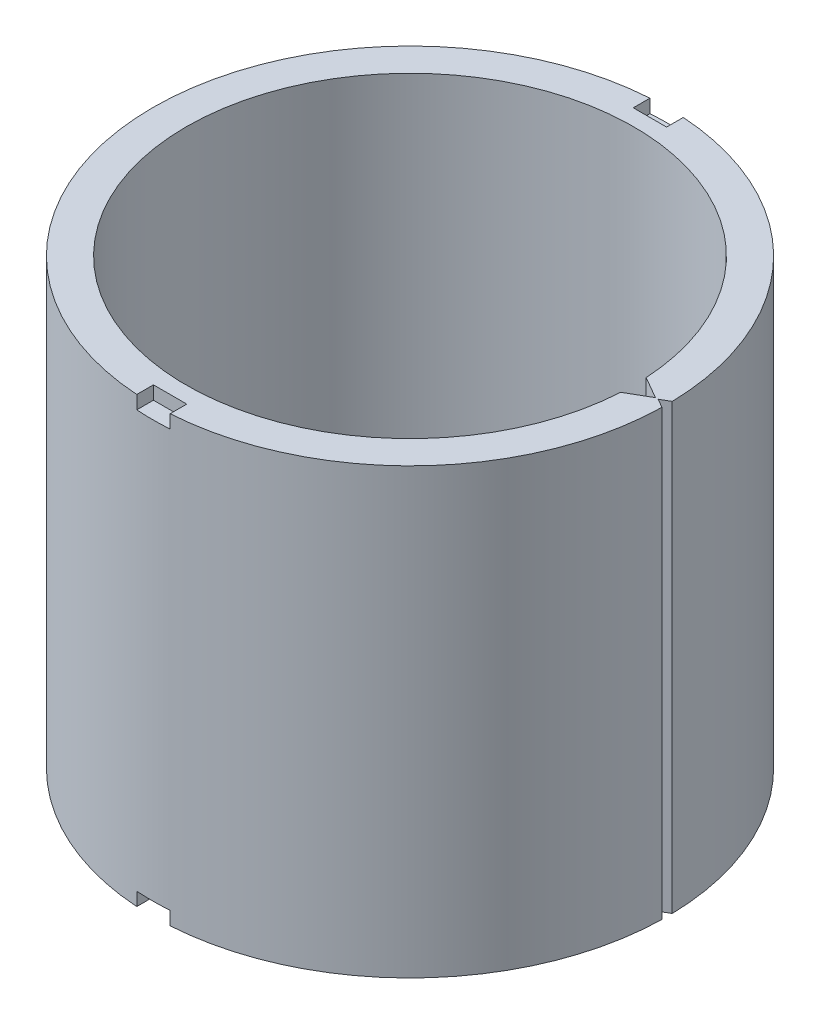
ISO-10303-21;
HEADER;
FILE_DESCRIPTION(('STEP AP214'),'2;1');
FILE_NAME('part.step','',(''),(''),'','','');
FILE_SCHEMA(('AUTOMOTIVE_DESIGN { 1 0 10303 214 1 1 1 1 }'));
ENDSEC;
DATA;
#1=APPLICATION_CONTEXT('core data for automotive mechanical design processes');
#2=APPLICATION_PROTOCOL_DEFINITION('international standard','automotive_design',2000,#1);
#3=PRODUCT_CONTEXT('',#1,'mechanical');
#4=PRODUCT('Part','Part','',(#3));
#5=PRODUCT_RELATED_PRODUCT_CATEGORY('part','',(#4));
#6=PRODUCT_DEFINITION_FORMATION('','',#4);
#7=PRODUCT_DEFINITION_CONTEXT('part definition',#1,'design');
#8=PRODUCT_DEFINITION('design','',#6,#7);
#9=PRODUCT_DEFINITION_SHAPE('','',#8);
#10=(LENGTH_UNIT() NAMED_UNIT(*) SI_UNIT(.MILLI.,.METRE.));
#11=(NAMED_UNIT(*) PLANE_ANGLE_UNIT() SI_UNIT($,.RADIAN.));
#12=(NAMED_UNIT(*) SI_UNIT($,.STERADIAN.) SOLID_ANGLE_UNIT());
#13=UNCERTAINTY_MEASURE_WITH_UNIT(LENGTH_MEASURE(1.E-05),#10,'distance_accuracy_value','');
#14=(GEOMETRIC_REPRESENTATION_CONTEXT(3) GLOBAL_UNCERTAINTY_ASSIGNED_CONTEXT((#13)) GLOBAL_UNIT_ASSIGNED_CONTEXT((#10,
#11,#12)) REPRESENTATION_CONTEXT('',''));
#15=CARTESIAN_POINT('',(0.,0.,0.));
#16=DIRECTION('',(0.,0.,1.));
#17=DIRECTION('',(1.,0.,0.));
#18=AXIS2_PLACEMENT_3D('',#15,#16,#17);
#19=CARTESIAN_POINT('',(24.4774366852604,0.,0.));
#20=DIRECTION('',(0.,1.,0.));
#21=DIRECTION('',(-1.,0.,0.));
#22=AXIS2_PLACEMENT_3D('',#19,#20,#21);
#23=PLANE('',#22);
#24=DIRECTION('',(0.866025403784441,0.,-0.499999999999995));
#25=VECTOR('',#24,1.);
#26=CARTESIAN_POINT('',(23.368,0.,0.));
#27=LINE('',#26,#25);
#28=CARTESIAN_POINT('',(21.2679023900433,0.,1.21249192043296));
#29=VERTEX_POINT('',#28);
#30=CARTESIAN_POINT('',(23.368,0.,0.));
#31=VERTEX_POINT('',#30);
#32=EDGE_CURVE('E381',#29,#31,#27,.T.);
#33=ORIENTED_EDGE('',*,*,#32,.T.);
#34=DIRECTION('',(-0.866025403784438,0.,-0.500000000000001));
#35=VECTOR('',#34,1.);
#36=CARTESIAN_POINT('',(21.2679023900433,0.,-1.21249192043298));
#37=LINE('',#36,#35);
#38=CARTESIAN_POINT('',(21.2679023900433,0.,-1.21249192043298));
#39=VERTEX_POINT('',#38);
#40=EDGE_CURVE('E382',#31,#39,#37,.T.);
#41=ORIENTED_EDGE('',*,*,#40,.T.);
#42=CARTESIAN_POINT('',(0.,0.,0.));
#43=DIRECTION('',(0.,1.,0.));
#44=DIRECTION('',(-1.,0.,0.));
#45=AXIS2_PLACEMENT_3D('',#42,#43,#44);
#46=CIRCLE('',#45,21.3024366852603);
#47=EDGE_CURVE('E226',#39,#29,#46,.T.);
#48=ORIENTED_EDGE('',*,*,#47,.T.);
#49=EDGE_LOOP('',(#33,#41,#48));
#50=FACE_BOUND('',#49,.T.);
#51=DIRECTION('',(-0.866025403784443,0.,0.499999999999993));
#52=VECTOR('',#51,1.);
#53=CARTESIAN_POINT('',(24.4725107788167,0.,-0.491042627098511));
#54=LINE('',#53,#52);
#55=CARTESIAN_POINT('',(24.4725107788167,0.,-0.491042627098511));
#56=VERTEX_POINT('',#55);
#57=CARTESIAN_POINT('',(23.622,0.,0.));
#58=VERTEX_POINT('',#57);
#59=EDGE_CURVE('E184',#56,#58,#54,.T.);
#60=ORIENTED_EDGE('',*,*,#59,.T.);
#61=DIRECTION('',(0.866025403784438,0.,0.500000000000002));
#62=VECTOR('',#61,1.);
#63=CARTESIAN_POINT('',(23.622,0.,0.));
#64=LINE('',#63,#62);
#65=CARTESIAN_POINT('',(24.4725107788167,0.,0.491042627098525));
#66=VERTEX_POINT('',#65);
#67=EDGE_CURVE('E192',#58,#66,#64,.T.);
#68=ORIENTED_EDGE('',*,*,#67,.T.);
#69=CARTESIAN_POINT('',(0.,0.,0.));
#70=DIRECTION('',(0.,1.,0.));
#71=DIRECTION('',(-1.,0.,0.));
#72=AXIS2_PLACEMENT_3D('',#69,#70,#71);
#73=CIRCLE('',#72,24.4774366852604);
#74=CARTESIAN_POINT('',(1.58750000000001,0.,24.4259032674521));
#75=VERTEX_POINT('',#74);
#76=EDGE_CURVE('E209',#75,#66,#73,.T.);
#77=ORIENTED_EDGE('',*,*,#76,.F.);
#78=DIRECTION('',(0.,0.,-1.));
#79=VECTOR('',#78,1.);
#80=CARTESIAN_POINT('',(1.58750000000001,0.,26.0134032674521));
#81=LINE('',#80,#79);
#82=CARTESIAN_POINT('',(1.58750000000001,0.,22.8384032674521));
#83=VERTEX_POINT('',#82);
#84=EDGE_CURVE('E203',#75,#83,#81,.T.);
#85=ORIENTED_EDGE('',*,*,#84,.T.);
#86=DIRECTION('',(-1.,0.,0.));
#87=VECTOR('',#86,1.);
#88=CARTESIAN_POINT('',(1.58750000000001,0.,22.8384032674521));
#89=LINE('',#88,#87);
#90=CARTESIAN_POINT('',(-1.58750000000001,0.,22.8384032674521));
#91=VERTEX_POINT('',#90);
#92=EDGE_CURVE('E292',#83,#91,#89,.T.);
#93=ORIENTED_EDGE('',*,*,#92,.T.);
#94=DIRECTION('',(0.,0.,1.));
#95=VECTOR('',#94,1.);
#96=CARTESIAN_POINT('',(-1.58750000000001,0.,26.0134032674521));
#97=LINE('',#96,#95);
#98=CARTESIAN_POINT('',(-1.58750000000001,0.,24.4259032674521));
#99=VERTEX_POINT('',#98);
#100=EDGE_CURVE('E299',#91,#99,#97,.T.);
#101=ORIENTED_EDGE('',*,*,#100,.T.);
#102=CARTESIAN_POINT('',(-1.5875,0.,-24.4259032674521));
#103=VERTEX_POINT('',#102);
#104=EDGE_CURVE('E210',#103,#99,#73,.T.);
#105=ORIENTED_EDGE('',*,*,#104,.F.);
#106=DIRECTION('',(0.,0.,1.));
#107=VECTOR('',#106,1.);
#108=CARTESIAN_POINT('',(-1.5875,0.,-26.0134032674521));
#109=LINE('',#108,#107);
#110=CARTESIAN_POINT('',(-1.5875,0.,-22.8384032674521));
#111=VERTEX_POINT('',#110);
#112=EDGE_CURVE('E273',#103,#111,#109,.T.);
#113=ORIENTED_EDGE('',*,*,#112,.T.);
#114=DIRECTION('',(1.,0.,0.));
#115=VECTOR('',#114,1.);
#116=CARTESIAN_POINT('',(-1.5875,0.,-22.8384032674521));
#117=LINE('',#116,#115);
#118=CARTESIAN_POINT('',(1.5875,0.,-22.8384032674521));
#119=VERTEX_POINT('',#118);
#120=EDGE_CURVE('E269',#111,#119,#117,.T.);
#121=ORIENTED_EDGE('',*,*,#120,.T.);
#122=DIRECTION('',(0.,0.,-1.));
#123=VECTOR('',#122,1.);
#124=CARTESIAN_POINT('',(1.5875,0.,-26.0134032674521));
#125=LINE('',#124,#123);
#126=CARTESIAN_POINT('',(1.5875,0.,-24.4259032674521));
#127=VERTEX_POINT('',#126);
#128=EDGE_CURVE('E208',#119,#127,#125,.T.);
#129=ORIENTED_EDGE('',*,*,#128,.T.);
#130=EDGE_CURVE('E199',#56,#127,#73,.T.);
#131=ORIENTED_EDGE('',*,*,#130,.F.);
#132=EDGE_LOOP('',(#60,#68,#77,#85,#93,#101,#105,#113,#121,#129,#131));
#133=FACE_BOUND('',#132,.T.);
#134=ADVANCED_FACE('F37',(#50,#133),#23,.F.);
#135=CARTESIAN_POINT('',(0.,38.0941971854585,0.));
#136=DIRECTION('',(0.,1.,0.));
#137=DIRECTION('',(-1.,0.,0.));
#138=AXIS2_PLACEMENT_3D('',#135,#136,#137);
#139=CYLINDRICAL_SURFACE('',#138,24.4774366852604);
#140=DIRECTION('',(0.,-1.,0.));
#141=VECTOR('',#140,1.);
#142=CARTESIAN_POINT('',(24.4725107788167,42.2216971854585,-0.491042627098511));
#143=LINE('',#142,#141);
#144=CARTESIAN_POINT('',(24.4725107788167,42.2216971854585,-0.491042627098511));
#145=VERTEX_POINT('',#144);
#146=EDGE_CURVE('E187',#145,#56,#143,.T.);
#147=ORIENTED_EDGE('',*,*,#146,.T.);
#148=ORIENTED_EDGE('',*,*,#130,.T.);
#149=DIRECTION('',(0.,1.,0.));
#150=VECTOR('',#149,1.);
#151=CARTESIAN_POINT('',(1.5875,38.0941971854585,-24.4259032674521));
#152=LINE('',#151,#150);
#153=CARTESIAN_POINT('',(1.5875,1.27,-24.4259032674521));
#154=VERTEX_POINT('',#153);
#155=EDGE_CURVE('E44',#154,#127,#152,.F.);
#156=ORIENTED_EDGE('',*,*,#155,.F.);
#157=CARTESIAN_POINT('',(0.,1.27,0.));
#158=DIRECTION('',(0.,-1.,0.));
#159=DIRECTION('',(1.,0.,0.));
#160=AXIS2_PLACEMENT_3D('',#157,#158,#159);
#161=CIRCLE('',#160,24.4774366852604);
#162=CARTESIAN_POINT('',(-1.5875,1.27,-24.4259032674521));
#163=VERTEX_POINT('',#162);
#164=EDGE_CURVE('E251',#163,#154,#161,.T.);
#165=ORIENTED_EDGE('',*,*,#164,.F.);
#166=DIRECTION('',(0.,1.,0.));
#167=VECTOR('',#166,1.);
#168=CARTESIAN_POINT('',(-1.5875,38.0941971854585,-24.4259032674521));
#169=LINE('',#168,#167);
#170=EDGE_CURVE('E11',#103,#163,#169,.T.);
#171=ORIENTED_EDGE('',*,*,#170,.F.);
#172=ORIENTED_EDGE('',*,*,#104,.T.);
#173=DIRECTION('',(0.,1.,0.));
#174=VECTOR('',#173,1.);
#175=CARTESIAN_POINT('',(-1.58750000000001,38.0941971854585,24.4259032674521));
#176=LINE('',#175,#174);
#177=CARTESIAN_POINT('',(-1.58750000000001,1.27,24.4259032674521));
#178=VERTEX_POINT('',#177);
#179=EDGE_CURVE('E246',#178,#99,#176,.F.);
#180=ORIENTED_EDGE('',*,*,#179,.F.);
#181=CARTESIAN_POINT('',(0.,1.27,0.));
#182=DIRECTION('',(0.,-1.,0.));
#183=DIRECTION('',(1.,0.,0.));
#184=AXIS2_PLACEMENT_3D('',#181,#182,#183);
#185=CIRCLE('',#184,24.4774366852604);
#186=CARTESIAN_POINT('',(1.58750000000001,1.27,24.4259032674521));
#187=VERTEX_POINT('',#186);
#188=EDGE_CURVE('E244',#187,#178,#185,.T.);
#189=ORIENTED_EDGE('',*,*,#188,.F.);
#190=DIRECTION('',(0.,1.,0.));
#191=VECTOR('',#190,1.);
#192=CARTESIAN_POINT('',(1.58750000000001,38.0941971854585,24.4259032674521));
#193=LINE('',#192,#191);
#194=EDGE_CURVE('E248',#75,#187,#193,.T.);
#195=ORIENTED_EDGE('',*,*,#194,.F.);
#196=ORIENTED_EDGE('',*,*,#76,.T.);
#197=DIRECTION('',(0.,-1.,0.));
#198=VECTOR('',#197,1.);
#199=CARTESIAN_POINT('',(24.4725107788167,42.2216971854585,0.491042627098525));
#200=LINE('',#199,#198);
#201=CARTESIAN_POINT('',(24.4725107788167,42.2216971854585,0.491042627098525));
#202=VERTEX_POINT('',#201);
#203=EDGE_CURVE('E610',#202,#66,#200,.T.);
#204=ORIENTED_EDGE('',*,*,#203,.F.);
#205=CARTESIAN_POINT('',(0.,42.2216971854585,0.));
#206=DIRECTION('',(0.,1.,0.));
#207=DIRECTION('',(-1.,0.,0.));
#208=AXIS2_PLACEMENT_3D('',#205,#206,#207);
#209=CIRCLE('',#208,24.4774366852604);
#210=CARTESIAN_POINT('',(1.58750000000001,42.2216971854585,24.4259032674521));
#211=VERTEX_POINT('',#210);
#212=EDGE_CURVE('E222',#211,#202,#209,.T.);
#213=ORIENTED_EDGE('',*,*,#212,.F.);
#214=DIRECTION('',(0.,1.,0.));
#215=VECTOR('',#214,1.);
#216=CARTESIAN_POINT('',(1.58750000000001,38.0941971854585,24.4259032674521));
#217=LINE('',#216,#215);
#218=CARTESIAN_POINT('',(1.58750000000001,40.9516971854585,24.4259032674521));
#219=VERTEX_POINT('',#218);
#220=EDGE_CURVE('E234',#211,#219,#217,.F.);
#221=ORIENTED_EDGE('',*,*,#220,.T.);
#222=CARTESIAN_POINT('',(0.,40.9516971854585,0.));
#223=DIRECTION('',(0.,1.,0.));
#224=DIRECTION('',(0.,0.,1.));
#225=AXIS2_PLACEMENT_3D('',#222,#223,#224);
#226=CIRCLE('',#225,24.4774366852604);
#227=CARTESIAN_POINT('',(-1.58750000000001,40.9516971854585,24.4259032674521));
#228=VERTEX_POINT('',#227);
#229=EDGE_CURVE('E229',#228,#219,#226,.T.);
#230=ORIENTED_EDGE('',*,*,#229,.F.);
#231=DIRECTION('',(0.,1.,0.));
#232=VECTOR('',#231,1.);
#233=CARTESIAN_POINT('',(-1.58750000000001,38.0941971854585,24.4259032674521));
#234=LINE('',#233,#232);
#235=CARTESIAN_POINT('',(-1.58750000000001,42.2216971854585,24.4259032674521));
#236=VERTEX_POINT('',#235);
#237=EDGE_CURVE('E231',#228,#236,#234,.T.);
#238=ORIENTED_EDGE('',*,*,#237,.T.);
#239=CARTESIAN_POINT('',(-1.5875,42.2216971854585,-24.4259032674521));
#240=VERTEX_POINT('',#239);
#241=EDGE_CURVE('E213',#240,#236,#209,.T.);
#242=ORIENTED_EDGE('',*,*,#241,.F.);
#243=DIRECTION('',(0.,1.,0.));
#244=VECTOR('',#243,1.);
#245=CARTESIAN_POINT('',(-1.5875,38.0941971854585,-24.4259032674521));
#246=LINE('',#245,#244);
#247=CARTESIAN_POINT('',(-1.5875,40.9516971854585,-24.4259032674521));
#248=VERTEX_POINT('',#247);
#249=EDGE_CURVE('E241',#240,#248,#246,.F.);
#250=ORIENTED_EDGE('',*,*,#249,.T.);
#251=CARTESIAN_POINT('',(0.,40.9516971854585,0.));
#252=DIRECTION('',(0.,1.,0.));
#253=DIRECTION('',(0.,0.,1.));
#254=AXIS2_PLACEMENT_3D('',#251,#252,#253);
#255=CIRCLE('',#254,24.4774366852604);
#256=CARTESIAN_POINT('',(1.5875,40.9516971854585,-24.4259032674521));
#257=VERTEX_POINT('',#256);
#258=EDGE_CURVE('E237',#257,#248,#255,.T.);
#259=ORIENTED_EDGE('',*,*,#258,.F.);
#260=DIRECTION('',(0.,1.,0.));
#261=VECTOR('',#260,1.);
#262=CARTESIAN_POINT('',(1.5875,38.0941971854585,-24.4259032674521));
#263=LINE('',#262,#261);
#264=CARTESIAN_POINT('',(1.5875,42.2216971854585,-24.4259032674521));
#265=VERTEX_POINT('',#264);
#266=EDGE_CURVE('E239',#257,#265,#263,.T.);
#267=ORIENTED_EDGE('',*,*,#266,.T.);
#268=EDGE_CURVE('E202',#145,#265,#209,.T.);
#269=ORIENTED_EDGE('',*,*,#268,.F.);
#270=EDGE_LOOP('',(#147,#148,#156,#165,#171,#172,#180,#189,#195,#196,#204,#213,#221,#230,#238,
#242,#250,#259,#267,#269));
#271=FACE_BOUND('',#270,.T.);
#272=ADVANCED_FACE('F197',(#271),#139,.T.);
#273=CARTESIAN_POINT('',(0.,38.0941971854585,0.));
#274=DIRECTION('',(0.,1.,0.));
#275=DIRECTION('',(-1.,0.,0.));
#276=AXIS2_PLACEMENT_3D('',#273,#274,#275);
#277=CYLINDRICAL_SURFACE('',#276,21.3024366852603);
#278=DIRECTION('',(0.,-1.,0.));
#279=VECTOR('',#278,1.);
#280=CARTESIAN_POINT('',(21.2679023900433,42.2216971854585,1.21249192043296));
#281=LINE('',#280,#279);
#282=CARTESIAN_POINT('',(21.2679023900433,42.2216971854585,1.21249192043296));
#283=VERTEX_POINT('',#282);
#284=EDGE_CURVE('E193',#283,#29,#281,.T.);
#285=ORIENTED_EDGE('',*,*,#284,.T.);
#286=ORIENTED_EDGE('',*,*,#47,.F.);
#287=DIRECTION('',(0.,-1.,0.));
#288=VECTOR('',#287,1.);
#289=CARTESIAN_POINT('',(21.2679023900433,42.2216971854585,-1.21249192043298));
#290=LINE('',#289,#288);
#291=CARTESIAN_POINT('',(21.2679023900433,42.2216971854585,-1.21249192043298));
#292=VERTEX_POINT('',#291);
#293=EDGE_CURVE('E394',#292,#39,#290,.T.);
#294=ORIENTED_EDGE('',*,*,#293,.F.);
#295=CARTESIAN_POINT('',(0.,42.2216971854585,0.));
#296=DIRECTION('',(0.,1.,0.));
#297=DIRECTION('',(-1.,0.,0.));
#298=AXIS2_PLACEMENT_3D('',#295,#296,#297);
#299=CIRCLE('',#298,21.3024366852603);
#300=EDGE_CURVE('E223',#292,#283,#299,.T.);
#301=ORIENTED_EDGE('',*,*,#300,.T.);
#302=EDGE_LOOP('',(#285,#286,#294,#301));
#303=FACE_BOUND('',#302,.T.);
#304=ADVANCED_FACE('F368',(#303),#277,.F.);
#305=CARTESIAN_POINT('',(21.3024366852603,42.2216971854585,0.));
#306=DIRECTION('',(0.,-1.,0.));
#307=DIRECTION('',(1.,0.,0.));
#308=AXIS2_PLACEMENT_3D('',#305,#306,#307);
#309=PLANE('',#308);
#310=DIRECTION('',(0.866025403784441,0.,-0.499999999999995));
#311=VECTOR('',#310,1.);
#312=CARTESIAN_POINT('',(23.368,42.2216971854585,0.));
#313=LINE('',#312,#311);
#314=CARTESIAN_POINT('',(23.368,42.2216971854585,0.));
#315=VERTEX_POINT('',#314);
#316=EDGE_CURVE('E387',#283,#315,#313,.T.);
#317=ORIENTED_EDGE('',*,*,#316,.F.);
#318=ORIENTED_EDGE('',*,*,#300,.F.);
#319=DIRECTION('',(-0.866025403784438,0.,-0.500000000000001));
#320=VECTOR('',#319,1.);
#321=CARTESIAN_POINT('',(21.2679023900433,42.2216971854585,-1.21249192043298));
#322=LINE('',#321,#320);
#323=EDGE_CURVE('E392',#315,#292,#322,.T.);
#324=ORIENTED_EDGE('',*,*,#323,.F.);
#325=EDGE_LOOP('',(#317,#318,#324));
#326=FACE_BOUND('',#325,.T.);
#327=DIRECTION('',(-0.866025403784443,0.,0.499999999999993));
#328=VECTOR('',#327,1.);
#329=CARTESIAN_POINT('',(24.4725107788167,42.2216971854585,-0.491042627098511));
#330=LINE('',#329,#328);
#331=CARTESIAN_POINT('',(23.622,42.2216971854585,0.));
#332=VERTEX_POINT('',#331);
#333=EDGE_CURVE('E607',#145,#332,#330,.T.);
#334=ORIENTED_EDGE('',*,*,#333,.F.);
#335=ORIENTED_EDGE('',*,*,#268,.T.);
#336=DIRECTION('',(0.,0.,-1.));
#337=VECTOR('',#336,1.);
#338=CARTESIAN_POINT('',(1.5875,42.2216971854585,-26.0134032674521));
#339=LINE('',#338,#337);
#340=CARTESIAN_POINT('',(1.5875,42.2216971854585,-22.8384032674521));
#341=VERTEX_POINT('',#340);
#342=EDGE_CURVE('E308',#341,#265,#339,.T.);
#343=ORIENTED_EDGE('',*,*,#342,.F.);
#344=DIRECTION('',(1.,0.,0.));
#345=VECTOR('',#344,1.);
#346=CARTESIAN_POINT('',(-1.5875,42.2216971854585,-22.8384032674521));
#347=LINE('',#346,#345);
#348=CARTESIAN_POINT('',(-1.5875,42.2216971854585,-22.8384032674521));
#349=VERTEX_POINT('',#348);
#350=EDGE_CURVE('E316',#349,#341,#347,.T.);
#351=ORIENTED_EDGE('',*,*,#350,.F.);
#352=DIRECTION('',(0.,0.,1.));
#353=VECTOR('',#352,1.);
#354=CARTESIAN_POINT('',(-1.5875,42.2216971854585,-26.0134032674521));
#355=LINE('',#354,#353);
#356=EDGE_CURVE('E314',#240,#349,#355,.T.);
#357=ORIENTED_EDGE('',*,*,#356,.F.);
#358=ORIENTED_EDGE('',*,*,#241,.T.);
#359=DIRECTION('',(0.,0.,1.));
#360=VECTOR('',#359,1.);
#361=CARTESIAN_POINT('',(-1.58750000000001,42.2216971854585,26.0134032674521));
#362=LINE('',#361,#360);
#363=CARTESIAN_POINT('',(-1.58750000000001,42.2216971854585,22.8384032674521));
#364=VERTEX_POINT('',#363);
#365=EDGE_CURVE('E328',#364,#236,#362,.T.);
#366=ORIENTED_EDGE('',*,*,#365,.F.);
#367=DIRECTION('',(-1.,0.,0.));
#368=VECTOR('',#367,1.);
#369=CARTESIAN_POINT('',(1.5875,42.2216971854585,22.8384032674521));
#370=LINE('',#369,#368);
#371=CARTESIAN_POINT('',(1.5875,42.2216971854585,22.8384032674521));
#372=VERTEX_POINT('',#371);
#373=EDGE_CURVE('E334',#372,#364,#370,.T.);
#374=ORIENTED_EDGE('',*,*,#373,.F.);
#375=DIRECTION('',(0.,0.,-1.));
#376=VECTOR('',#375,1.);
#377=CARTESIAN_POINT('',(1.58750000000001,42.2216971854585,26.0134032674521));
#378=LINE('',#377,#376);
#379=EDGE_CURVE('E286',#211,#372,#378,.T.);
#380=ORIENTED_EDGE('',*,*,#379,.F.);
#381=ORIENTED_EDGE('',*,*,#212,.T.);
#382=DIRECTION('',(0.866025403784438,0.,0.500000000000002));
#383=VECTOR('',#382,1.);
#384=CARTESIAN_POINT('',(23.622,42.2216971854585,0.));
#385=LINE('',#384,#383);
#386=EDGE_CURVE('E608',#332,#202,#385,.T.);
#387=ORIENTED_EDGE('',*,*,#386,.F.);
#388=EDGE_LOOP('',(#334,#335,#343,#351,#357,#358,#366,#374,#380,#381,#387));
#389=FACE_BOUND('',#388,.T.);
#390=ADVANCED_FACE('F350',(#326,#389),#309,.F.);
#391=CARTESIAN_POINT('',(1.58750000000001,40.9516971854585,26.0134032674521));
#392=DIRECTION('',(1.,0.,0.));
#393=DIRECTION('',(0.,0.,-1.));
#394=AXIS2_PLACEMENT_3D('',#391,#392,#393);
#395=PLANE('',#394);
#396=ORIENTED_EDGE('',*,*,#379,.T.);
#397=DIRECTION('',(0.,1.,0.));
#398=VECTOR('',#397,1.);
#399=CARTESIAN_POINT('',(1.5875,40.9516971854585,22.8384032674521));
#400=LINE('',#399,#398);
#401=CARTESIAN_POINT('',(1.5875,40.9516971854585,22.8384032674521));
#402=VERTEX_POINT('',#401);
#403=EDGE_CURVE('E218',#402,#372,#400,.T.);
#404=ORIENTED_EDGE('',*,*,#403,.F.);
#405=DIRECTION('',(0.,0.,-1.));
#406=VECTOR('',#405,1.);
#407=CARTESIAN_POINT('',(1.58750000000001,40.9516971854585,26.0134032674521));
#408=LINE('',#407,#406);
#409=EDGE_CURVE('E325',#219,#402,#408,.T.);
#410=ORIENTED_EDGE('',*,*,#409,.F.);
#411=ORIENTED_EDGE('',*,*,#220,.F.);
#412=EDGE_LOOP('',(#396,#404,#410,#411));
#413=FACE_BOUND('',#412,.T.);
#414=ADVANCED_FACE('F360',(#413),#395,.F.);
#415=CARTESIAN_POINT('',(-1.58750000000001,40.9516971854585,26.0134032674521));
#416=DIRECTION('',(-1.,0.,0.));
#417=DIRECTION('',(0.,0.,1.));
#418=AXIS2_PLACEMENT_3D('',#415,#416,#417);
#419=PLANE('',#418);
#420=DIRECTION('',(0.,0.,1.));
#421=VECTOR('',#420,1.);
#422=CARTESIAN_POINT('',(-1.58750000000001,40.9516971854585,26.0134032674521));
#423=LINE('',#422,#421);
#424=CARTESIAN_POINT('',(-1.58750000000001,40.9516971854585,22.8384032674521));
#425=VERTEX_POINT('',#424);
#426=EDGE_CURVE('E331',#425,#228,#423,.T.);
#427=ORIENTED_EDGE('',*,*,#426,.F.);
#428=DIRECTION('',(0.,1.,0.));
#429=VECTOR('',#428,1.);
#430=CARTESIAN_POINT('',(-1.58750000000001,40.9516971854585,22.8384032674521));
#431=LINE('',#430,#429);
#432=EDGE_CURVE('E317',#425,#364,#431,.T.);
#433=ORIENTED_EDGE('',*,*,#432,.T.);
#434=ORIENTED_EDGE('',*,*,#365,.T.);
#435=ORIENTED_EDGE('',*,*,#237,.F.);
#436=EDGE_LOOP('',(#427,#433,#434,#435));
#437=FACE_BOUND('',#436,.T.);
#438=ADVANCED_FACE('F356',(#437),#419,.F.);
#439=CARTESIAN_POINT('',(0.,40.9516971854585,0.));
#440=DIRECTION('',(0.,1.,0.));
#441=DIRECTION('',(0.,0.,1.));
#442=AXIS2_PLACEMENT_3D('',#439,#440,#441);
#443=PLANE('',#442);
#444=ORIENTED_EDGE('',*,*,#229,.T.);
#445=ORIENTED_EDGE('',*,*,#409,.T.);
#446=DIRECTION('',(-1.,0.,0.));
#447=VECTOR('',#446,1.);
#448=CARTESIAN_POINT('',(1.5875,40.9516971854585,22.8384032674521));
#449=LINE('',#448,#447);
#450=EDGE_CURVE('E327',#402,#425,#449,.T.);
#451=ORIENTED_EDGE('',*,*,#450,.T.);
#452=ORIENTED_EDGE('',*,*,#426,.T.);
#453=EDGE_LOOP('',(#444,#445,#451,#452));
#454=FACE_BOUND('',#453,.T.);
#455=ADVANCED_FACE('F359',(#454),#443,.T.);
#456=CARTESIAN_POINT('',(1.5875,40.9516971854585,22.8384032674521));
#457=DIRECTION('',(0.,0.,-1.));
#458=DIRECTION('',(-1.,0.,0.));
#459=AXIS2_PLACEMENT_3D('',#456,#457,#458);
#460=PLANE('',#459);
#461=ORIENTED_EDGE('',*,*,#373,.T.);
#462=ORIENTED_EDGE('',*,*,#432,.F.);
#463=ORIENTED_EDGE('',*,*,#450,.F.);
#464=ORIENTED_EDGE('',*,*,#403,.T.);
#465=EDGE_LOOP('',(#461,#462,#463,#464));
#466=FACE_BOUND('',#465,.T.);
#467=ADVANCED_FACE('F344',(#466),#460,.F.);
#468=CARTESIAN_POINT('',(-1.5875,40.9516971854585,-26.0134032674521));
#469=DIRECTION('',(-1.,0.,0.));
#470=DIRECTION('',(0.,0.,1.));
#471=AXIS2_PLACEMENT_3D('',#468,#469,#470);
#472=PLANE('',#471);
#473=ORIENTED_EDGE('',*,*,#356,.T.);
#474=DIRECTION('',(0.,1.,0.));
#475=VECTOR('',#474,1.);
#476=CARTESIAN_POINT('',(-1.5875,40.9516971854585,-22.8384032674521));
#477=LINE('',#476,#475);
#478=CARTESIAN_POINT('',(-1.5875,40.9516971854585,-22.8384032674521));
#479=VERTEX_POINT('',#478);
#480=EDGE_CURVE('E313',#479,#349,#477,.T.);
#481=ORIENTED_EDGE('',*,*,#480,.F.);
#482=DIRECTION('',(0.,0.,1.));
#483=VECTOR('',#482,1.);
#484=CARTESIAN_POINT('',(-1.5875,40.9516971854585,-26.0134032674521));
#485=LINE('',#484,#483);
#486=EDGE_CURVE('E305',#248,#479,#485,.T.);
#487=ORIENTED_EDGE('',*,*,#486,.F.);
#488=ORIENTED_EDGE('',*,*,#249,.F.);
#489=EDGE_LOOP('',(#473,#481,#487,#488));
#490=FACE_BOUND('',#489,.T.);
#491=ADVANCED_FACE('F438',(#490),#472,.F.);
#492=CARTESIAN_POINT('',(1.5875,40.9516971854585,-26.0134032674521));
#493=DIRECTION('',(1.,0.,0.));
#494=DIRECTION('',(0.,0.,-1.));
#495=AXIS2_PLACEMENT_3D('',#492,#493,#494);
#496=PLANE('',#495);
#497=DIRECTION('',(0.,0.,-1.));
#498=VECTOR('',#497,1.);
#499=CARTESIAN_POINT('',(1.5875,40.9516971854585,-26.0134032674521));
#500=LINE('',#499,#498);
#501=CARTESIAN_POINT('',(1.5875,40.9516971854585,-22.8384032674521));
#502=VERTEX_POINT('',#501);
#503=EDGE_CURVE('E311',#502,#257,#500,.T.);
#504=ORIENTED_EDGE('',*,*,#503,.F.);
#505=DIRECTION('',(0.,1.,0.));
#506=VECTOR('',#505,1.);
#507=CARTESIAN_POINT('',(1.5875,40.9516971854585,-22.8384032674521));
#508=LINE('',#507,#506);
#509=EDGE_CURVE('E215',#502,#341,#508,.T.);
#510=ORIENTED_EDGE('',*,*,#509,.T.);
#511=ORIENTED_EDGE('',*,*,#342,.T.);
#512=ORIENTED_EDGE('',*,*,#266,.F.);
#513=EDGE_LOOP('',(#504,#510,#511,#512));
#514=FACE_BOUND('',#513,.T.);
#515=ADVANCED_FACE('F434',(#514),#496,.F.);
#516=CARTESIAN_POINT('',(0.,40.9516971854585,0.));
#517=DIRECTION('',(0.,1.,0.));
#518=DIRECTION('',(0.,0.,1.));
#519=AXIS2_PLACEMENT_3D('',#516,#517,#518);
#520=PLANE('',#519);
#521=ORIENTED_EDGE('',*,*,#258,.T.);
#522=ORIENTED_EDGE('',*,*,#486,.T.);
#523=DIRECTION('',(1.,0.,0.));
#524=VECTOR('',#523,1.);
#525=CARTESIAN_POINT('',(-1.5875,40.9516971854585,-22.8384032674521));
#526=LINE('',#525,#524);
#527=EDGE_CURVE('E307',#479,#502,#526,.T.);
#528=ORIENTED_EDGE('',*,*,#527,.T.);
#529=ORIENTED_EDGE('',*,*,#503,.T.);
#530=EDGE_LOOP('',(#521,#522,#528,#529));
#531=FACE_BOUND('',#530,.T.);
#532=ADVANCED_FACE('F431',(#531),#520,.T.);
#533=CARTESIAN_POINT('',(-1.5875,40.9516971854585,-22.8384032674521));
#534=DIRECTION('',(0.,0.,1.));
#535=DIRECTION('',(1.,0.,0.));
#536=AXIS2_PLACEMENT_3D('',#533,#534,#535);
#537=PLANE('',#536);
#538=ORIENTED_EDGE('',*,*,#350,.T.);
#539=ORIENTED_EDGE('',*,*,#509,.F.);
#540=ORIENTED_EDGE('',*,*,#527,.F.);
#541=ORIENTED_EDGE('',*,*,#480,.T.);
#542=EDGE_LOOP('',(#538,#539,#540,#541));
#543=FACE_BOUND('',#542,.T.);
#544=ADVANCED_FACE('F429',(#543),#537,.F.);
#545=CARTESIAN_POINT('',(1.58750000000001,1.27,26.0134032674521));
#546=DIRECTION('',(-1.,0.,0.));
#547=DIRECTION('',(0.,0.,1.));
#548=AXIS2_PLACEMENT_3D('',#545,#546,#547);
#549=PLANE('',#548);
#550=ORIENTED_EDGE('',*,*,#194,.T.);
#551=DIRECTION('',(0.,0.,-1.));
#552=VECTOR('',#551,1.);
#553=CARTESIAN_POINT('',(1.58750000000001,1.27,26.0134032674521));
#554=LINE('',#553,#552);
#555=CARTESIAN_POINT('',(1.58750000000001,1.27,22.8384032674521));
#556=VERTEX_POINT('',#555);
#557=EDGE_CURVE('E289',#187,#556,#554,.T.);
#558=ORIENTED_EDGE('',*,*,#557,.T.);
#559=DIRECTION('',(0.,-1.,0.));
#560=VECTOR('',#559,1.);
#561=CARTESIAN_POINT('',(1.58750000000001,1.27,22.8384032674521));
#562=LINE('',#561,#560);
#563=EDGE_CURVE('E275',#556,#83,#562,.T.);
#564=ORIENTED_EDGE('',*,*,#563,.T.);
#565=ORIENTED_EDGE('',*,*,#84,.F.);
#566=EDGE_LOOP('',(#550,#558,#564,#565));
#567=FACE_BOUND('',#566,.T.);
#568=ADVANCED_FACE('F425',(#567),#549,.T.);
#569=CARTESIAN_POINT('',(-1.58750000000001,1.27,26.0134032674521));
#570=DIRECTION('',(1.,0.,0.));
#571=DIRECTION('',(0.,0.,-1.));
#572=AXIS2_PLACEMENT_3D('',#569,#570,#571);
#573=PLANE('',#572);
#574=ORIENTED_EDGE('',*,*,#179,.T.);
#575=ORIENTED_EDGE('',*,*,#100,.F.);
#576=DIRECTION('',(0.,-1.,0.));
#577=VECTOR('',#576,1.);
#578=CARTESIAN_POINT('',(-1.58750000000001,1.27,22.8384032674521));
#579=LINE('',#578,#577);
#580=CARTESIAN_POINT('',(-1.58750000000001,1.27,22.8384032674521));
#581=VERTEX_POINT('',#580);
#582=EDGE_CURVE('E279',#581,#91,#579,.T.);
#583=ORIENTED_EDGE('',*,*,#582,.F.);
#584=DIRECTION('',(0.,0.,1.));
#585=VECTOR('',#584,1.);
#586=CARTESIAN_POINT('',(-1.58750000000001,1.27,26.0134032674521));
#587=LINE('',#586,#585);
#588=EDGE_CURVE('E291',#581,#178,#587,.T.);
#589=ORIENTED_EDGE('',*,*,#588,.T.);
#590=EDGE_LOOP('',(#574,#575,#583,#589));
#591=FACE_BOUND('',#590,.T.);
#592=ADVANCED_FACE('F418',(#591),#573,.T.);
#593=CARTESIAN_POINT('',(0.,1.27,0.));
#594=DIRECTION('',(0.,-1.,0.));
#595=DIRECTION('',(0.,0.,1.));
#596=AXIS2_PLACEMENT_3D('',#593,#594,#595);
#597=PLANE('',#596);
#598=ORIENTED_EDGE('',*,*,#188,.T.);
#599=ORIENTED_EDGE('',*,*,#588,.F.);
#600=DIRECTION('',(-1.,0.,0.));
#601=VECTOR('',#600,1.);
#602=CARTESIAN_POINT('',(1.58750000000001,1.27,22.8384032674521));
#603=LINE('',#602,#601);
#604=EDGE_CURVE('E295',#556,#581,#603,.T.);
#605=ORIENTED_EDGE('',*,*,#604,.F.);
#606=ORIENTED_EDGE('',*,*,#557,.F.);
#607=EDGE_LOOP('',(#598,#599,#605,#606));
#608=FACE_BOUND('',#607,.T.);
#609=ADVANCED_FACE('F415',(#608),#597,.T.);
#610=CARTESIAN_POINT('',(1.58750000000001,1.27,22.8384032674521));
#611=DIRECTION('',(0.,0.,1.));
#612=DIRECTION('',(1.,0.,0.));
#613=AXIS2_PLACEMENT_3D('',#610,#611,#612);
#614=PLANE('',#613);
#615=ORIENTED_EDGE('',*,*,#92,.F.);
#616=ORIENTED_EDGE('',*,*,#563,.F.);
#617=ORIENTED_EDGE('',*,*,#604,.T.);
#618=ORIENTED_EDGE('',*,*,#582,.T.);
#619=EDGE_LOOP('',(#615,#616,#617,#618));
#620=FACE_BOUND('',#619,.T.);
#621=ADVANCED_FACE('F414',(#620),#614,.T.);
#622=CARTESIAN_POINT('',(-1.5875,1.27,-26.0134032674521));
#623=DIRECTION('',(1.,0.,0.));
#624=DIRECTION('',(0.,0.,-1.));
#625=AXIS2_PLACEMENT_3D('',#622,#623,#624);
#626=PLANE('',#625);
#627=ORIENTED_EDGE('',*,*,#170,.T.);
#628=DIRECTION('',(0.,0.,1.));
#629=VECTOR('',#628,1.);
#630=CARTESIAN_POINT('',(-1.5875,1.27,-26.0134032674521));
#631=LINE('',#630,#629);
#632=CARTESIAN_POINT('',(-1.5875,1.27,-22.8384032674521));
#633=VERTEX_POINT('',#632);
#634=EDGE_CURVE('E264',#163,#633,#631,.T.);
#635=ORIENTED_EDGE('',*,*,#634,.T.);
#636=DIRECTION('',(0.,-1.,0.));
#637=VECTOR('',#636,1.);
#638=CARTESIAN_POINT('',(-1.5875,1.27,-22.8384032674521));
#639=LINE('',#638,#637);
#640=EDGE_CURVE('E274',#633,#111,#639,.T.);
#641=ORIENTED_EDGE('',*,*,#640,.T.);
#642=ORIENTED_EDGE('',*,*,#112,.F.);
#643=EDGE_LOOP('',(#627,#635,#641,#642));
#644=FACE_BOUND('',#643,.T.);
#645=ADVANCED_FACE('F271',(#644),#626,.T.);
#646=CARTESIAN_POINT('',(1.5875,1.27,-26.0134032674521));
#647=DIRECTION('',(-1.,0.,0.));
#648=DIRECTION('',(0.,0.,1.));
#649=AXIS2_PLACEMENT_3D('',#646,#647,#648);
#650=PLANE('',#649);
#651=ORIENTED_EDGE('',*,*,#155,.T.);
#652=ORIENTED_EDGE('',*,*,#128,.F.);
#653=DIRECTION('',(0.,-1.,0.));
#654=VECTOR('',#653,1.);
#655=CARTESIAN_POINT('',(1.5875,1.27,-22.8384032674521));
#656=LINE('',#655,#654);
#657=CARTESIAN_POINT('',(1.5875,1.27,-22.8384032674521));
#658=VERTEX_POINT('',#657);
#659=EDGE_CURVE('E287',#658,#119,#656,.T.);
#660=ORIENTED_EDGE('',*,*,#659,.F.);
#661=DIRECTION('',(0.,0.,-1.));
#662=VECTOR('',#661,1.);
#663=CARTESIAN_POINT('',(1.5875,1.27,-26.0134032674521));
#664=LINE('',#663,#662);
#665=EDGE_CURVE('E257',#658,#154,#664,.T.);
#666=ORIENTED_EDGE('',*,*,#665,.T.);
#667=EDGE_LOOP('',(#651,#652,#660,#666));
#668=FACE_BOUND('',#667,.T.);
#669=ADVANCED_FACE('F254',(#668),#650,.T.);
#670=CARTESIAN_POINT('',(0.,1.27,0.));
#671=DIRECTION('',(0.,-1.,0.));
#672=DIRECTION('',(0.,0.,1.));
#673=AXIS2_PLACEMENT_3D('',#670,#671,#672);
#674=PLANE('',#673);
#675=ORIENTED_EDGE('',*,*,#164,.T.);
#676=ORIENTED_EDGE('',*,*,#665,.F.);
#677=DIRECTION('',(1.,0.,0.));
#678=VECTOR('',#677,1.);
#679=CARTESIAN_POINT('',(-1.5875,1.27,-22.8384032674521));
#680=LINE('',#679,#678);
#681=EDGE_CURVE('E265',#633,#658,#680,.T.);
#682=ORIENTED_EDGE('',*,*,#681,.F.);
#683=ORIENTED_EDGE('',*,*,#634,.F.);
#684=EDGE_LOOP('',(#675,#676,#682,#683));
#685=FACE_BOUND('',#684,.T.);
#686=ADVANCED_FACE('F262',(#685),#674,.T.);
#687=CARTESIAN_POINT('',(-1.5875,1.27,-22.8384032674521));
#688=DIRECTION('',(0.,0.,-1.));
#689=DIRECTION('',(-1.,0.,0.));
#690=AXIS2_PLACEMENT_3D('',#687,#688,#689);
#691=PLANE('',#690);
#692=ORIENTED_EDGE('',*,*,#120,.F.);
#693=ORIENTED_EDGE('',*,*,#640,.F.);
#694=ORIENTED_EDGE('',*,*,#681,.T.);
#695=ORIENTED_EDGE('',*,*,#659,.T.);
#696=EDGE_LOOP('',(#692,#693,#694,#695));
#697=FACE_BOUND('',#696,.T.);
#698=ADVANCED_FACE('F398',(#697),#691,.T.);
#699=CARTESIAN_POINT('',(23.368,42.2216971854585,0.));
#700=DIRECTION('',(-0.499999999999995,0.,-0.866025403784442));
#701=DIRECTION('',(-0.866025403784442,0.,0.499999999999995));
#702=AXIS2_PLACEMENT_3D('',#699,#700,#701);
#703=PLANE('',#702);
#704=ORIENTED_EDGE('',*,*,#284,.F.);
#705=ORIENTED_EDGE('',*,*,#316,.T.);
#706=DIRECTION('',(0.,-1.,0.));
#707=VECTOR('',#706,1.);
#708=CARTESIAN_POINT('',(23.368,42.2216971854585,0.));
#709=LINE('',#708,#707);
#710=EDGE_CURVE('E59',#315,#31,#709,.T.);
#711=ORIENTED_EDGE('',*,*,#710,.T.);
#712=ORIENTED_EDGE('',*,*,#32,.F.);
#713=EDGE_LOOP('',(#704,#705,#711,#712));
#714=FACE_BOUND('',#713,.T.);
#715=ADVANCED_FACE('F400',(#714),#703,.T.);
#716=CARTESIAN_POINT('',(21.2679023900433,42.2216971854585,-1.21249192043298));
#717=DIRECTION('',(-0.500000000000001,0.,0.866025403784438));
#718=DIRECTION('',(0.866025403784438,0.,0.500000000000001));
#719=AXIS2_PLACEMENT_3D('',#716,#717,#718);
#720=PLANE('',#719);
#721=ORIENTED_EDGE('',*,*,#710,.F.);
#722=ORIENTED_EDGE('',*,*,#323,.T.);
#723=ORIENTED_EDGE('',*,*,#293,.T.);
#724=ORIENTED_EDGE('',*,*,#40,.F.);
#725=EDGE_LOOP('',(#721,#722,#723,#724));
#726=FACE_BOUND('',#725,.T.);
#727=ADVANCED_FACE('F406',(#726),#720,.T.);
#728=CARTESIAN_POINT('',(24.4725107788167,42.2216971854585,-0.491042627098511));
#729=DIRECTION('',(0.499999999999993,0.,0.866025403784443));
#730=DIRECTION('',(0.866025403784443,0.,-0.499999999999993));
#731=AXIS2_PLACEMENT_3D('',#728,#729,#730);
#732=PLANE('',#731);
#733=ORIENTED_EDGE('',*,*,#146,.F.);
#734=ORIENTED_EDGE('',*,*,#333,.T.);
#735=DIRECTION('',(0.,-1.,0.));
#736=VECTOR('',#735,1.);
#737=CARTESIAN_POINT('',(23.622,42.2216971854585,0.));
#738=LINE('',#737,#736);
#739=EDGE_CURVE('E51',#332,#58,#738,.T.);
#740=ORIENTED_EDGE('',*,*,#739,.T.);
#741=ORIENTED_EDGE('',*,*,#59,.F.);
#742=EDGE_LOOP('',(#733,#734,#740,#741));
#743=FACE_BOUND('',#742,.T.);
#744=ADVANCED_FACE('F186',(#743),#732,.T.);
#745=CARTESIAN_POINT('',(23.622,42.2216971854585,0.));
#746=DIRECTION('',(0.500000000000002,0.,-0.866025403784438));
#747=DIRECTION('',(-0.866025403784438,0.,-0.500000000000002));
#748=AXIS2_PLACEMENT_3D('',#745,#746,#747);
#749=PLANE('',#748);
#750=ORIENTED_EDGE('',*,*,#739,.F.);
#751=ORIENTED_EDGE('',*,*,#386,.T.);
#752=ORIENTED_EDGE('',*,*,#203,.T.);
#753=ORIENTED_EDGE('',*,*,#67,.F.);
#754=EDGE_LOOP('',(#750,#751,#752,#753));
#755=FACE_BOUND('',#754,.T.);
#756=ADVANCED_FACE('F544',(#755),#749,.T.);
#757=CLOSED_SHELL('',(#134,#272,#304,#390,#414,#438,#455,#467,#491,#515,#532,#544,#568,#592,
#609,#621,#645,#669,#686,#698,#715,#727,#744,#756));
#758=MANIFOLD_SOLID_BREP('B2',#757);
#759=ADVANCED_BREP_SHAPE_REPRESENTATION('',(#18,#758),#14);
#760=SHAPE_DEFINITION_REPRESENTATION(#9,#759);
ENDSEC;
END-ISO-10303-21;
